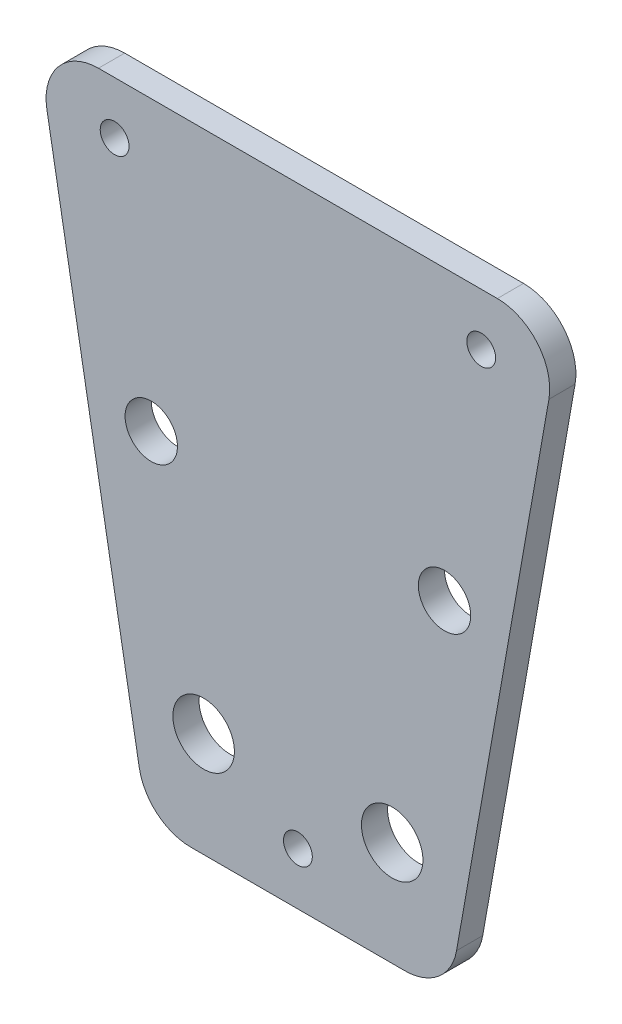
ISO-10303-21;
HEADER;
FILE_DESCRIPTION(('STEP AP214'),'2;1');
FILE_NAME('part.step','',(''),(''),'','','');
FILE_SCHEMA(('AUTOMOTIVE_DESIGN { 1 0 10303 214 1 1 1 1 }'));
ENDSEC;
DATA;
#1=APPLICATION_CONTEXT('core data for automotive mechanical design processes');
#2=APPLICATION_PROTOCOL_DEFINITION('international standard','automotive_design',2000,#1);
#3=PRODUCT_CONTEXT('',#1,'mechanical');
#4=PRODUCT('Part','Part','',(#3));
#5=PRODUCT_RELATED_PRODUCT_CATEGORY('part','',(#4));
#6=PRODUCT_DEFINITION_FORMATION('','',#4);
#7=PRODUCT_DEFINITION_CONTEXT('part definition',#1,'design');
#8=PRODUCT_DEFINITION('design','',#6,#7);
#9=PRODUCT_DEFINITION_SHAPE('','',#8);
#10=(LENGTH_UNIT() NAMED_UNIT(*) SI_UNIT(.MILLI.,.METRE.));
#11=(NAMED_UNIT(*) PLANE_ANGLE_UNIT() SI_UNIT($,.RADIAN.));
#12=(NAMED_UNIT(*) SI_UNIT($,.STERADIAN.) SOLID_ANGLE_UNIT());
#13=UNCERTAINTY_MEASURE_WITH_UNIT(LENGTH_MEASURE(1.E-05),#10,'distance_accuracy_value','');
#14=(GEOMETRIC_REPRESENTATION_CONTEXT(3) GLOBAL_UNCERTAINTY_ASSIGNED_CONTEXT((#13)) GLOBAL_UNIT_ASSIGNED_CONTEXT((#10,
#11,#12)) REPRESENTATION_CONTEXT('',''));
#15=CARTESIAN_POINT('',(0.,0.,0.));
#16=DIRECTION('',(0.,0.,1.));
#17=DIRECTION('',(1.,0.,0.));
#18=AXIS2_PLACEMENT_3D('',#15,#16,#17);
#19=CARTESIAN_POINT('',(20.4490036882272,10.,2.5));
#20=DIRECTION('',(0.,0.,1.));
#21=DIRECTION('',(1.,0.,0.));
#22=AXIS2_PLACEMENT_3D('',#19,#20,#21);
#23=PLANE('',#22);
#24=CARTESIAN_POINT('',(-28.,65.,2.5));
#25=DIRECTION('',(0.,0.,1.));
#26=DIRECTION('',(-1.,0.,0.));
#27=AXIS2_PLACEMENT_3D('',#24,#25,#26);
#28=CIRCLE('',#27,5.);
#29=CARTESIAN_POINT('',(-33.,65.,2.5));
#30=VERTEX_POINT('',#29);
#31=EDGE_CURVE('E251',#30,#30,#28,.T.);
#32=ORIENTED_EDGE('',*,*,#31,.F.);
#33=EDGE_LOOP('',(#32));
#34=FACE_BOUND('',#33,.T.);
#35=CARTESIAN_POINT('',(35.,110.,2.5));
#36=DIRECTION('',(0.,0.,1.));
#37=DIRECTION('',(1.,0.,0.));
#38=AXIS2_PLACEMENT_3D('',#35,#36,#37);
#39=CIRCLE('',#38,2.75);
#40=CARTESIAN_POINT('',(37.75,110.,2.5));
#41=VERTEX_POINT('',#40);
#42=EDGE_CURVE('E235',#41,#41,#39,.T.);
#43=ORIENTED_EDGE('',*,*,#42,.F.);
#44=EDGE_LOOP('',(#43));
#45=FACE_BOUND('',#44,.T.);
#46=CARTESIAN_POINT('',(18.,20.,2.5));
#47=DIRECTION('',(0.,0.,1.));
#48=DIRECTION('',(1.,0.,0.));
#49=AXIS2_PLACEMENT_3D('',#46,#47,#48);
#50=CIRCLE('',#49,5.87351911594449);
#51=CARTESIAN_POINT('',(23.8735191159445,20.,2.5));
#52=VERTEX_POINT('',#51);
#53=EDGE_CURVE('E219',#52,#52,#50,.T.);
#54=ORIENTED_EDGE('',*,*,#53,.F.);
#55=EDGE_LOOP('',(#54));
#56=FACE_BOUND('',#55,.T.);
#57=CARTESIAN_POINT('',(20.4490036882272,10.,2.5));
#58=DIRECTION('',(0.,0.,1.));
#59=DIRECTION('',(1.,0.,0.));
#60=AXIS2_PLACEMENT_3D('',#57,#58,#59);
#61=CIRCLE('',#60,10.);
#62=CARTESIAN_POINT('',(20.4490036882271,0.,2.5));
#63=VERTEX_POINT('',#62);
#64=CARTESIAN_POINT('',(30.2970812183493,8.26351822333078,2.5));
#65=VERTEX_POINT('',#64);
#66=EDGE_CURVE('E170',#63,#65,#61,.T.);
#67=ORIENTED_EDGE('',*,*,#66,.T.);
#68=DIRECTION('',(0.173648177666927,0.984807753012208,0.));
#69=VECTOR('',#68,1.);
#70=CARTESIAN_POINT('',(30.2970812183493,8.26351822333078,2.5));
#71=LINE('',#70,#69);
#72=CARTESIAN_POINT('',(47.9297792891954,108.263518223331,2.5));
#73=VERTEX_POINT('',#72);
#74=EDGE_CURVE('E106',#65,#73,#71,.T.);
#75=ORIENTED_EDGE('',*,*,#74,.T.);
#76=CARTESIAN_POINT('',(38.0817017590733,110.,2.5));
#77=DIRECTION('',(0.,0.,1.));
#78=DIRECTION('',(1.,0.,0.));
#79=AXIS2_PLACEMENT_3D('',#76,#77,#78);
#80=CIRCLE('',#79,10.);
#81=CARTESIAN_POINT('',(38.0817017590733,120.,2.5));
#82=VERTEX_POINT('',#81);
#83=EDGE_CURVE('E191',#73,#82,#80,.T.);
#84=ORIENTED_EDGE('',*,*,#83,.T.);
#85=DIRECTION('',(-1.,0.,0.));
#86=VECTOR('',#85,1.);
#87=CARTESIAN_POINT('',(38.0817017590733,120.,2.5));
#88=LINE('',#87,#86);
#89=CARTESIAN_POINT('',(-38.0817017590733,120.,2.5));
#90=VERTEX_POINT('',#89);
#91=EDGE_CURVE('E205',#82,#90,#88,.T.);
#92=ORIENTED_EDGE('',*,*,#91,.T.);
#93=CARTESIAN_POINT('',(-38.0817017590733,110.,2.5));
#94=DIRECTION('',(0.,0.,1.));
#95=DIRECTION('',(-1.,0.,0.));
#96=AXIS2_PLACEMENT_3D('',#93,#94,#95);
#97=CIRCLE('',#96,10.);
#98=CARTESIAN_POINT('',(-47.9297792891954,108.263518223331,2.5));
#99=VERTEX_POINT('',#98);
#100=EDGE_CURVE('E125',#90,#99,#97,.T.);
#101=ORIENTED_EDGE('',*,*,#100,.T.);
#102=DIRECTION('',(0.173648177666927,-0.984807753012208,0.));
#103=VECTOR('',#102,1.);
#104=CARTESIAN_POINT('',(-30.2970812183493,8.26351822333078,2.5));
#105=LINE('',#104,#103);
#106=CARTESIAN_POINT('',(-30.2970812183493,8.26351822333078,2.5));
#107=VERTEX_POINT('',#106);
#108=EDGE_CURVE('E119',#99,#107,#105,.T.);
#109=ORIENTED_EDGE('',*,*,#108,.T.);
#110=CARTESIAN_POINT('',(-20.4490036882272,10.,2.5));
#111=DIRECTION('',(0.,0.,1.));
#112=DIRECTION('',(-1.,0.,0.));
#113=AXIS2_PLACEMENT_3D('',#110,#111,#112);
#114=CIRCLE('',#113,10.);
#115=CARTESIAN_POINT('',(-20.4490036882271,0.,2.5));
#116=VERTEX_POINT('',#115);
#117=EDGE_CURVE('E123',#107,#116,#114,.T.);
#118=ORIENTED_EDGE('',*,*,#117,.T.);
#119=DIRECTION('',(1.,0.,0.));
#120=VECTOR('',#119,1.);
#121=CARTESIAN_POINT('',(-20.4490036882271,0.,2.5));
#122=LINE('',#121,#120);
#123=EDGE_CURVE('E63',#116,#63,#122,.T.);
#124=ORIENTED_EDGE('',*,*,#123,.T.);
#125=EDGE_LOOP('',(#67,#75,#84,#92,#101,#109,#118,#124));
#126=FACE_BOUND('',#125,.T.);
#127=CARTESIAN_POINT('',(28.,65.,2.5));
#128=DIRECTION('',(0.,0.,1.));
#129=DIRECTION('',(1.,0.,0.));
#130=AXIS2_PLACEMENT_3D('',#127,#128,#129);
#131=CIRCLE('',#130,5.);
#132=CARTESIAN_POINT('',(33.,65.,2.5));
#133=VERTEX_POINT('',#132);
#134=EDGE_CURVE('E152',#133,#133,#131,.T.);
#135=ORIENTED_EDGE('',*,*,#134,.F.);
#136=EDGE_LOOP('',(#135));
#137=FACE_BOUND('',#136,.T.);
#138=CARTESIAN_POINT('',(0.,10.,2.5));
#139=DIRECTION('',(0.,0.,1.));
#140=DIRECTION('',(1.,0.,0.));
#141=AXIS2_PLACEMENT_3D('',#138,#139,#140);
#142=CIRCLE('',#141,2.75);
#143=CARTESIAN_POINT('',(2.75,10.,2.5));
#144=VERTEX_POINT('',#143);
#145=EDGE_CURVE('E227',#144,#144,#142,.T.);
#146=ORIENTED_EDGE('',*,*,#145,.F.);
#147=EDGE_LOOP('',(#146));
#148=FACE_BOUND('',#147,.T.);
#149=CARTESIAN_POINT('',(-18.,20.,2.5));
#150=DIRECTION('',(0.,0.,1.));
#151=DIRECTION('',(-1.,0.,0.));
#152=AXIS2_PLACEMENT_3D('',#149,#150,#151);
#153=CIRCLE('',#152,5.87351911594449);
#154=CARTESIAN_POINT('',(-23.8735191159445,20.,2.5));
#155=VERTEX_POINT('',#154);
#156=EDGE_CURVE('E243',#155,#155,#153,.T.);
#157=ORIENTED_EDGE('',*,*,#156,.F.);
#158=EDGE_LOOP('',(#157));
#159=FACE_BOUND('',#158,.T.);
#160=CARTESIAN_POINT('',(-35.,110.,2.5));
#161=DIRECTION('',(0.,0.,1.));
#162=DIRECTION('',(-1.,0.,0.));
#163=AXIS2_PLACEMENT_3D('',#160,#161,#162);
#164=CIRCLE('',#163,2.75);
#165=CARTESIAN_POINT('',(-37.75,110.,2.5));
#166=VERTEX_POINT('',#165);
#167=EDGE_CURVE('E259',#166,#166,#164,.T.);
#168=ORIENTED_EDGE('',*,*,#167,.F.);
#169=EDGE_LOOP('',(#168));
#170=FACE_BOUND('',#169,.T.);
#171=ADVANCED_FACE('F45',(#34,#45,#56,#126,#137,#148,#159,#170),#23,.T.);
#172=CARTESIAN_POINT('',(20.4490036882272,10.,-2.5));
#173=DIRECTION('',(0.,0.,1.));
#174=DIRECTION('',(1.,0.,0.));
#175=AXIS2_PLACEMENT_3D('',#172,#173,#174);
#176=PLANE('',#175);
#177=CARTESIAN_POINT('',(20.4490036882272,10.,-2.5));
#178=DIRECTION('',(0.,0.,1.));
#179=DIRECTION('',(1.,0.,0.));
#180=AXIS2_PLACEMENT_3D('',#177,#178,#179);
#181=CIRCLE('',#180,10.);
#182=CARTESIAN_POINT('',(20.4490036882271,0.,-2.5));
#183=VERTEX_POINT('',#182);
#184=CARTESIAN_POINT('',(30.2970812183493,8.26351822333078,-2.5));
#185=VERTEX_POINT('',#184);
#186=EDGE_CURVE('E147',#183,#185,#181,.T.);
#187=ORIENTED_EDGE('',*,*,#186,.F.);
#188=DIRECTION('',(1.,0.,0.));
#189=VECTOR('',#188,1.);
#190=CARTESIAN_POINT('',(-20.4490036882271,0.,-2.5));
#191=LINE('',#190,#189);
#192=CARTESIAN_POINT('',(-20.4490036882271,0.,-2.5));
#193=VERTEX_POINT('',#192);
#194=EDGE_CURVE('E98',#193,#183,#191,.T.);
#195=ORIENTED_EDGE('',*,*,#194,.F.);
#196=CARTESIAN_POINT('',(-20.4490036882272,10.,-2.5));
#197=DIRECTION('',(0.,0.,1.));
#198=DIRECTION('',(-1.,0.,0.));
#199=AXIS2_PLACEMENT_3D('',#196,#197,#198);
#200=CIRCLE('',#199,10.);
#201=CARTESIAN_POINT('',(-30.2970812183493,8.26351822333078,-2.5));
#202=VERTEX_POINT('',#201);
#203=EDGE_CURVE('E92',#202,#193,#200,.T.);
#204=ORIENTED_EDGE('',*,*,#203,.F.);
#205=DIRECTION('',(0.173648177666927,-0.984807753012208,0.));
#206=VECTOR('',#205,1.);
#207=CARTESIAN_POINT('',(-30.2970812183493,8.26351822333078,-2.5));
#208=LINE('',#207,#206);
#209=CARTESIAN_POINT('',(-47.9297792891954,108.263518223331,-2.5));
#210=VERTEX_POINT('',#209);
#211=EDGE_CURVE('E134',#210,#202,#208,.T.);
#212=ORIENTED_EDGE('',*,*,#211,.F.);
#213=CARTESIAN_POINT('',(-38.0817017590733,110.,-2.5));
#214=DIRECTION('',(0.,0.,1.));
#215=DIRECTION('',(-1.,0.,0.));
#216=AXIS2_PLACEMENT_3D('',#213,#214,#215);
#217=CIRCLE('',#216,10.);
#218=CARTESIAN_POINT('',(-38.0817017590733,120.,-2.5));
#219=VERTEX_POINT('',#218);
#220=EDGE_CURVE('E161',#219,#210,#217,.T.);
#221=ORIENTED_EDGE('',*,*,#220,.F.);
#222=DIRECTION('',(-1.,0.,0.));
#223=VECTOR('',#222,1.);
#224=CARTESIAN_POINT('',(38.0817017590733,120.,-2.5));
#225=LINE('',#224,#223);
#226=CARTESIAN_POINT('',(38.0817017590733,120.,-2.5));
#227=VERTEX_POINT('',#226);
#228=EDGE_CURVE('E158',#227,#219,#225,.T.);
#229=ORIENTED_EDGE('',*,*,#228,.F.);
#230=CARTESIAN_POINT('',(38.0817017590733,110.,-2.5));
#231=DIRECTION('',(0.,0.,1.));
#232=DIRECTION('',(1.,0.,0.));
#233=AXIS2_PLACEMENT_3D('',#230,#231,#232);
#234=CIRCLE('',#233,10.);
#235=CARTESIAN_POINT('',(47.9297792891954,108.263518223331,-2.5));
#236=VERTEX_POINT('',#235);
#237=EDGE_CURVE('E155',#236,#227,#234,.T.);
#238=ORIENTED_EDGE('',*,*,#237,.F.);
#239=DIRECTION('',(0.173648177666927,0.984807753012208,0.));
#240=VECTOR('',#239,1.);
#241=CARTESIAN_POINT('',(30.2970812183493,8.26351822333078,-2.5));
#242=LINE('',#241,#240);
#243=EDGE_CURVE('E151',#185,#236,#242,.T.);
#244=ORIENTED_EDGE('',*,*,#243,.F.);
#245=EDGE_LOOP('',(#187,#195,#204,#212,#221,#229,#238,#244));
#246=FACE_BOUND('',#245,.T.);
#247=CARTESIAN_POINT('',(28.,65.,-2.5));
#248=DIRECTION('',(0.,0.,1.));
#249=DIRECTION('',(1.,0.,0.));
#250=AXIS2_PLACEMENT_3D('',#247,#248,#249);
#251=CIRCLE('',#250,5.);
#252=CARTESIAN_POINT('',(33.,65.,-2.5));
#253=VERTEX_POINT('',#252);
#254=EDGE_CURVE('E215',#253,#253,#251,.T.);
#255=ORIENTED_EDGE('',*,*,#254,.T.);
#256=EDGE_LOOP('',(#255));
#257=FACE_BOUND('',#256,.T.);
#258=CARTESIAN_POINT('',(18.,20.,-2.5));
#259=DIRECTION('',(0.,0.,1.));
#260=DIRECTION('',(1.,0.,0.));
#261=AXIS2_PLACEMENT_3D('',#258,#259,#260);
#262=CIRCLE('',#261,5.87351911594449);
#263=CARTESIAN_POINT('',(23.8735191159445,20.,-2.5));
#264=VERTEX_POINT('',#263);
#265=EDGE_CURVE('E223',#264,#264,#262,.T.);
#266=ORIENTED_EDGE('',*,*,#265,.T.);
#267=EDGE_LOOP('',(#266));
#268=FACE_BOUND('',#267,.T.);
#269=CARTESIAN_POINT('',(0.,10.,-2.5));
#270=DIRECTION('',(0.,0.,1.));
#271=DIRECTION('',(1.,0.,0.));
#272=AXIS2_PLACEMENT_3D('',#269,#270,#271);
#273=CIRCLE('',#272,2.75);
#274=CARTESIAN_POINT('',(2.75,10.,-2.5));
#275=VERTEX_POINT('',#274);
#276=EDGE_CURVE('E231',#275,#275,#273,.T.);
#277=ORIENTED_EDGE('',*,*,#276,.T.);
#278=EDGE_LOOP('',(#277));
#279=FACE_BOUND('',#278,.T.);
#280=CARTESIAN_POINT('',(35.,110.,-2.5));
#281=DIRECTION('',(0.,0.,1.));
#282=DIRECTION('',(1.,0.,0.));
#283=AXIS2_PLACEMENT_3D('',#280,#281,#282);
#284=CIRCLE('',#283,2.75);
#285=CARTESIAN_POINT('',(37.75,110.,-2.5));
#286=VERTEX_POINT('',#285);
#287=EDGE_CURVE('E239',#286,#286,#284,.T.);
#288=ORIENTED_EDGE('',*,*,#287,.T.);
#289=EDGE_LOOP('',(#288));
#290=FACE_BOUND('',#289,.T.);
#291=CARTESIAN_POINT('',(-18.,20.,-2.5));
#292=DIRECTION('',(0.,0.,1.));
#293=DIRECTION('',(-1.,0.,0.));
#294=AXIS2_PLACEMENT_3D('',#291,#292,#293);
#295=CIRCLE('',#294,5.87351911594449);
#296=CARTESIAN_POINT('',(-23.8735191159445,20.,-2.5));
#297=VERTEX_POINT('',#296);
#298=EDGE_CURVE('E247',#297,#297,#295,.T.);
#299=ORIENTED_EDGE('',*,*,#298,.T.);
#300=EDGE_LOOP('',(#299));
#301=FACE_BOUND('',#300,.T.);
#302=CARTESIAN_POINT('',(-28.,65.,-2.5));
#303=DIRECTION('',(0.,0.,1.));
#304=DIRECTION('',(-1.,0.,0.));
#305=AXIS2_PLACEMENT_3D('',#302,#303,#304);
#306=CIRCLE('',#305,5.);
#307=CARTESIAN_POINT('',(-33.,65.,-2.5));
#308=VERTEX_POINT('',#307);
#309=EDGE_CURVE('E255',#308,#308,#306,.T.);
#310=ORIENTED_EDGE('',*,*,#309,.T.);
#311=EDGE_LOOP('',(#310));
#312=FACE_BOUND('',#311,.T.);
#313=CARTESIAN_POINT('',(-35.,110.,-2.5));
#314=DIRECTION('',(0.,0.,1.));
#315=DIRECTION('',(-1.,0.,0.));
#316=AXIS2_PLACEMENT_3D('',#313,#314,#315);
#317=CIRCLE('',#316,2.75);
#318=CARTESIAN_POINT('',(-37.75,110.,-2.5));
#319=VERTEX_POINT('',#318);
#320=EDGE_CURVE('E263',#319,#319,#317,.T.);
#321=ORIENTED_EDGE('',*,*,#320,.T.);
#322=EDGE_LOOP('',(#321));
#323=FACE_BOUND('',#322,.T.);
#324=ADVANCED_FACE('F195',(#246,#257,#268,#279,#290,#301,#312,#323),#176,.F.);
#325=CARTESIAN_POINT('',(20.4490036882272,10.,2.5));
#326=DIRECTION('',(0.,0.,-1.));
#327=DIRECTION('',(-1.,0.,0.));
#328=AXIS2_PLACEMENT_3D('',#325,#326,#327);
#329=CYLINDRICAL_SURFACE('',#328,10.);
#330=ORIENTED_EDGE('',*,*,#186,.T.);
#331=DIRECTION('',(0.,0.,-1.));
#332=VECTOR('',#331,1.);
#333=CARTESIAN_POINT('',(30.2970812183493,8.26351822333078,2.5));
#334=LINE('',#333,#332);
#335=EDGE_CURVE('E11',#65,#185,#334,.T.);
#336=ORIENTED_EDGE('',*,*,#335,.F.);
#337=ORIENTED_EDGE('',*,*,#66,.F.);
#338=DIRECTION('',(0.,0.,-1.));
#339=VECTOR('',#338,1.);
#340=CARTESIAN_POINT('',(20.4490036882271,0.,2.5));
#341=LINE('',#340,#339);
#342=EDGE_CURVE('E143',#63,#183,#341,.T.);
#343=ORIENTED_EDGE('',*,*,#342,.T.);
#344=EDGE_LOOP('',(#330,#336,#337,#343));
#345=FACE_BOUND('',#344,.T.);
#346=ADVANCED_FACE('F47',(#345),#329,.T.);
#347=CARTESIAN_POINT('',(30.2970812183493,8.26351822333078,2.5));
#348=DIRECTION('',(-0.984807753012209,0.173648177666927,0.));
#349=DIRECTION('',(-0.173648177666927,-0.984807753012209,0.));
#350=AXIS2_PLACEMENT_3D('',#347,#348,#349);
#351=PLANE('',#350);
#352=ORIENTED_EDGE('',*,*,#243,.T.);
#353=DIRECTION('',(0.,0.,-1.));
#354=VECTOR('',#353,1.);
#355=CARTESIAN_POINT('',(47.9297792891954,108.263518223331,2.5));
#356=LINE('',#355,#354);
#357=EDGE_CURVE('E55',#73,#236,#356,.T.);
#358=ORIENTED_EDGE('',*,*,#357,.F.);
#359=ORIENTED_EDGE('',*,*,#74,.F.);
#360=ORIENTED_EDGE('',*,*,#335,.T.);
#361=EDGE_LOOP('',(#352,#358,#359,#360));
#362=FACE_BOUND('',#361,.T.);
#363=ADVANCED_FACE('F299',(#362),#351,.F.);
#364=CARTESIAN_POINT('',(38.0817017590733,110.,2.5));
#365=DIRECTION('',(0.,0.,-1.));
#366=DIRECTION('',(-1.,0.,0.));
#367=AXIS2_PLACEMENT_3D('',#364,#365,#366);
#368=CYLINDRICAL_SURFACE('',#367,10.);
#369=ORIENTED_EDGE('',*,*,#237,.T.);
#370=DIRECTION('',(0.,0.,-1.));
#371=VECTOR('',#370,1.);
#372=CARTESIAN_POINT('',(38.0817017590733,120.,2.5));
#373=LINE('',#372,#371);
#374=EDGE_CURVE('E181',#82,#227,#373,.T.);
#375=ORIENTED_EDGE('',*,*,#374,.F.);
#376=ORIENTED_EDGE('',*,*,#83,.F.);
#377=ORIENTED_EDGE('',*,*,#357,.T.);
#378=EDGE_LOOP('',(#369,#375,#376,#377));
#379=FACE_BOUND('',#378,.T.);
#380=ADVANCED_FACE('F189',(#379),#368,.T.);
#381=CARTESIAN_POINT('',(38.0817017590733,120.,2.5));
#382=DIRECTION('',(0.,-1.,0.));
#383=DIRECTION('',(0.,0.,-1.));
#384=AXIS2_PLACEMENT_3D('',#381,#382,#383);
#385=PLANE('',#384);
#386=ORIENTED_EDGE('',*,*,#228,.T.);
#387=DIRECTION('',(0.,0.,-1.));
#388=VECTOR('',#387,1.);
#389=CARTESIAN_POINT('',(-38.0817017590733,120.,2.5));
#390=LINE('',#389,#388);
#391=EDGE_CURVE('E177',#90,#219,#390,.T.);
#392=ORIENTED_EDGE('',*,*,#391,.F.);
#393=ORIENTED_EDGE('',*,*,#91,.F.);
#394=ORIENTED_EDGE('',*,*,#374,.T.);
#395=EDGE_LOOP('',(#386,#392,#393,#394));
#396=FACE_BOUND('',#395,.T.);
#397=ADVANCED_FACE('F200',(#396),#385,.F.);
#398=CARTESIAN_POINT('',(-38.0817017590733,110.,2.5));
#399=DIRECTION('',(0.,0.,-1.));
#400=DIRECTION('',(-1.,0.,0.));
#401=AXIS2_PLACEMENT_3D('',#398,#399,#400);
#402=CYLINDRICAL_SURFACE('',#401,10.);
#403=ORIENTED_EDGE('',*,*,#220,.T.);
#404=DIRECTION('',(0.,0.,-1.));
#405=VECTOR('',#404,1.);
#406=CARTESIAN_POINT('',(-47.9297792891954,108.263518223331,2.5));
#407=LINE('',#406,#405);
#408=EDGE_CURVE('E136',#99,#210,#407,.T.);
#409=ORIENTED_EDGE('',*,*,#408,.F.);
#410=ORIENTED_EDGE('',*,*,#100,.F.);
#411=ORIENTED_EDGE('',*,*,#391,.T.);
#412=EDGE_LOOP('',(#403,#409,#410,#411));
#413=FACE_BOUND('',#412,.T.);
#414=ADVANCED_FACE('F203',(#413),#402,.T.);
#415=CARTESIAN_POINT('',(-30.2970812183493,8.26351822333078,2.5));
#416=DIRECTION('',(0.984807753012209,0.173648177666927,0.));
#417=DIRECTION('',(-0.173648177666927,0.984807753012209,0.));
#418=AXIS2_PLACEMENT_3D('',#415,#416,#417);
#419=PLANE('',#418);
#420=ORIENTED_EDGE('',*,*,#211,.T.);
#421=DIRECTION('',(0.,0.,-1.));
#422=VECTOR('',#421,1.);
#423=CARTESIAN_POINT('',(-30.2970812183493,8.26351822333078,2.5));
#424=LINE('',#423,#422);
#425=EDGE_CURVE('E131',#107,#202,#424,.T.);
#426=ORIENTED_EDGE('',*,*,#425,.F.);
#427=ORIENTED_EDGE('',*,*,#108,.F.);
#428=ORIENTED_EDGE('',*,*,#408,.T.);
#429=EDGE_LOOP('',(#420,#426,#427,#428));
#430=FACE_BOUND('',#429,.T.);
#431=ADVANCED_FACE('F132',(#430),#419,.F.);
#432=CARTESIAN_POINT('',(-20.4490036882272,10.,2.5));
#433=DIRECTION('',(0.,0.,-1.));
#434=DIRECTION('',(-1.,0.,0.));
#435=AXIS2_PLACEMENT_3D('',#432,#433,#434);
#436=CYLINDRICAL_SURFACE('',#435,10.);
#437=ORIENTED_EDGE('',*,*,#203,.T.);
#438=DIRECTION('',(0.,0.,-1.));
#439=VECTOR('',#438,1.);
#440=CARTESIAN_POINT('',(-20.4490036882271,0.,2.5));
#441=LINE('',#440,#439);
#442=EDGE_CURVE('E137',#116,#193,#441,.T.);
#443=ORIENTED_EDGE('',*,*,#442,.F.);
#444=ORIENTED_EDGE('',*,*,#117,.F.);
#445=ORIENTED_EDGE('',*,*,#425,.T.);
#446=EDGE_LOOP('',(#437,#443,#444,#445));
#447=FACE_BOUND('',#446,.T.);
#448=ADVANCED_FACE('F139',(#447),#436,.T.);
#449=CARTESIAN_POINT('',(-20.4490036882271,0.,2.5));
#450=DIRECTION('',(0.,1.,0.));
#451=DIRECTION('',(0.,0.,1.));
#452=AXIS2_PLACEMENT_3D('',#449,#450,#451);
#453=PLANE('',#452);
#454=ORIENTED_EDGE('',*,*,#194,.T.);
#455=ORIENTED_EDGE('',*,*,#342,.F.);
#456=ORIENTED_EDGE('',*,*,#123,.F.);
#457=ORIENTED_EDGE('',*,*,#442,.T.);
#458=EDGE_LOOP('',(#454,#455,#456,#457));
#459=FACE_BOUND('',#458,.T.);
#460=ADVANCED_FACE('F287',(#459),#453,.F.);
#461=CARTESIAN_POINT('',(28.,65.,2.5));
#462=DIRECTION('',(0.,0.,-1.));
#463=DIRECTION('',(-1.,0.,0.));
#464=AXIS2_PLACEMENT_3D('',#461,#462,#463);
#465=CYLINDRICAL_SURFACE('',#464,5.);
#466=ORIENTED_EDGE('',*,*,#134,.T.);
#467=EDGE_LOOP('',(#466));
#468=FACE_BOUND('',#467,.T.);
#469=ORIENTED_EDGE('',*,*,#254,.F.);
#470=EDGE_LOOP('',(#469));
#471=FACE_BOUND('',#470,.T.);
#472=ADVANCED_FACE('F284',(#468,#471),#465,.F.);
#473=CARTESIAN_POINT('',(18.,20.,2.5));
#474=DIRECTION('',(0.,0.,-1.));
#475=DIRECTION('',(-1.,0.,0.));
#476=AXIS2_PLACEMENT_3D('',#473,#474,#475);
#477=CYLINDRICAL_SURFACE('',#476,5.87351911594449);
#478=ORIENTED_EDGE('',*,*,#53,.T.);
#479=EDGE_LOOP('',(#478));
#480=FACE_BOUND('',#479,.T.);
#481=ORIENTED_EDGE('',*,*,#265,.F.);
#482=EDGE_LOOP('',(#481));
#483=FACE_BOUND('',#482,.T.);
#484=ADVANCED_FACE('F362',(#480,#483),#477,.F.);
#485=CARTESIAN_POINT('',(0.,10.,2.5));
#486=DIRECTION('',(0.,0.,-1.));
#487=DIRECTION('',(-1.,0.,0.));
#488=AXIS2_PLACEMENT_3D('',#485,#486,#487);
#489=CYLINDRICAL_SURFACE('',#488,2.75);
#490=ORIENTED_EDGE('',*,*,#145,.T.);
#491=EDGE_LOOP('',(#490));
#492=FACE_BOUND('',#491,.T.);
#493=ORIENTED_EDGE('',*,*,#276,.F.);
#494=EDGE_LOOP('',(#493));
#495=FACE_BOUND('',#494,.T.);
#496=ADVANCED_FACE('F370',(#492,#495),#489,.F.);
#497=CARTESIAN_POINT('',(35.,110.,2.5));
#498=DIRECTION('',(0.,0.,-1.));
#499=DIRECTION('',(-1.,0.,0.));
#500=AXIS2_PLACEMENT_3D('',#497,#498,#499);
#501=CYLINDRICAL_SURFACE('',#500,2.75);
#502=ORIENTED_EDGE('',*,*,#42,.T.);
#503=EDGE_LOOP('',(#502));
#504=FACE_BOUND('',#503,.T.);
#505=ORIENTED_EDGE('',*,*,#287,.F.);
#506=EDGE_LOOP('',(#505));
#507=FACE_BOUND('',#506,.T.);
#508=ADVANCED_FACE('F378',(#504,#507),#501,.F.);
#509=CARTESIAN_POINT('',(-18.,20.,2.5));
#510=DIRECTION('',(0.,0.,-1.));
#511=DIRECTION('',(-1.,0.,0.));
#512=AXIS2_PLACEMENT_3D('',#509,#510,#511);
#513=CYLINDRICAL_SURFACE('',#512,5.87351911594449);
#514=ORIENTED_EDGE('',*,*,#156,.T.);
#515=EDGE_LOOP('',(#514));
#516=FACE_BOUND('',#515,.T.);
#517=ORIENTED_EDGE('',*,*,#298,.F.);
#518=EDGE_LOOP('',(#517));
#519=FACE_BOUND('',#518,.T.);
#520=ADVANCED_FACE('F387',(#516,#519),#513,.F.);
#521=CARTESIAN_POINT('',(-28.,65.,2.5));
#522=DIRECTION('',(0.,0.,-1.));
#523=DIRECTION('',(-1.,0.,0.));
#524=AXIS2_PLACEMENT_3D('',#521,#522,#523);
#525=CYLINDRICAL_SURFACE('',#524,5.);
#526=ORIENTED_EDGE('',*,*,#31,.T.);
#527=EDGE_LOOP('',(#526));
#528=FACE_BOUND('',#527,.T.);
#529=ORIENTED_EDGE('',*,*,#309,.F.);
#530=EDGE_LOOP('',(#529));
#531=FACE_BOUND('',#530,.T.);
#532=ADVANCED_FACE('F396',(#528,#531),#525,.F.);
#533=CARTESIAN_POINT('',(-35.,110.,2.5));
#534=DIRECTION('',(0.,0.,-1.));
#535=DIRECTION('',(-1.,0.,0.));
#536=AXIS2_PLACEMENT_3D('',#533,#534,#535);
#537=CYLINDRICAL_SURFACE('',#536,2.75);
#538=ORIENTED_EDGE('',*,*,#167,.T.);
#539=EDGE_LOOP('',(#538));
#540=FACE_BOUND('',#539,.T.);
#541=ORIENTED_EDGE('',*,*,#320,.F.);
#542=EDGE_LOOP('',(#541));
#543=FACE_BOUND('',#542,.T.);
#544=ADVANCED_FACE('F271',(#540,#543),#537,.F.);
#545=CLOSED_SHELL('',(#171,#324,#346,#363,#380,#397,#414,#431,#448,#460,#472,#484,#496,#508,
#520,#532,#544));
#546=MANIFOLD_SOLID_BREP('B2',#545);
#547=ADVANCED_BREP_SHAPE_REPRESENTATION('',(#18,#546),#14);
#548=SHAPE_DEFINITION_REPRESENTATION(#9,#547);
ENDSEC;
END-ISO-10303-21;
